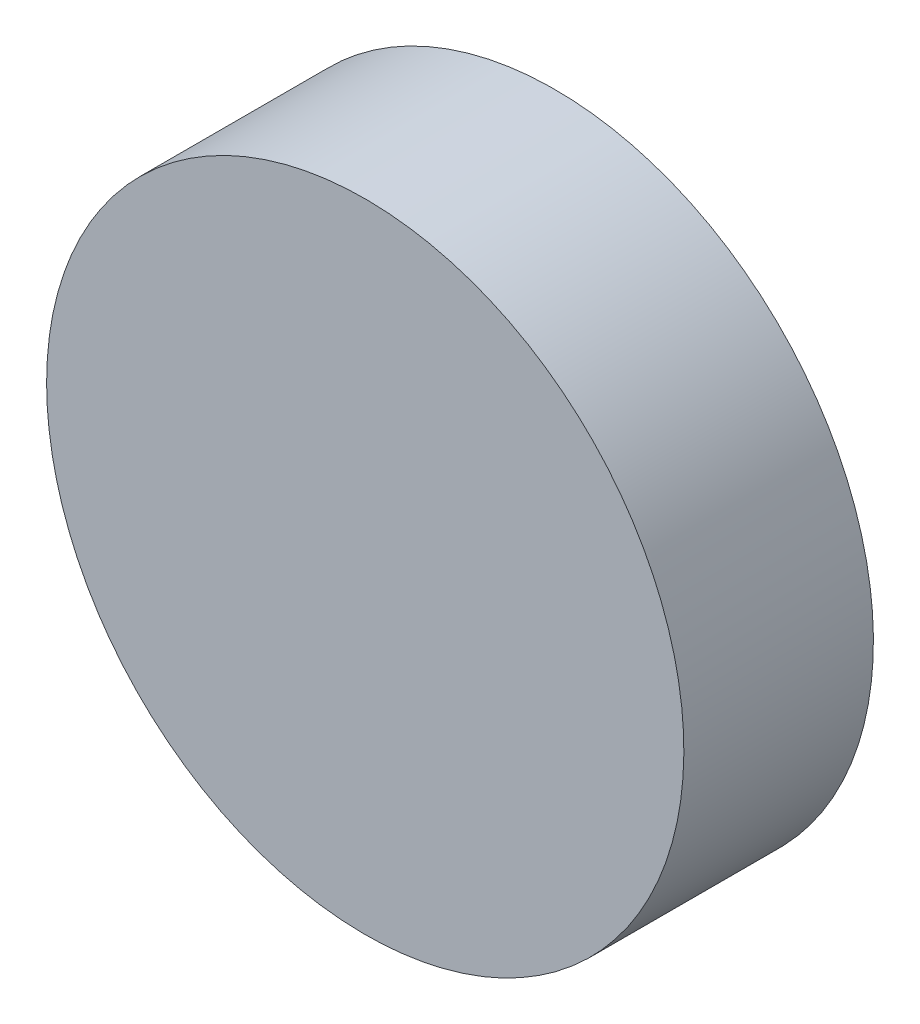
ISO-10303-21;
HEADER;
FILE_DESCRIPTION(('STEP AP214'),'2;1');
FILE_NAME('part.step','',(''),(''),'','','');
FILE_SCHEMA(('AUTOMOTIVE_DESIGN { 1 0 10303 214 1 1 1 1 }'));
ENDSEC;
DATA;
#1=APPLICATION_CONTEXT('core data for automotive mechanical design processes');
#2=APPLICATION_PROTOCOL_DEFINITION('international standard','automotive_design',2000,#1);
#3=PRODUCT_CONTEXT('',#1,'mechanical');
#4=PRODUCT('Part','Part','',(#3));
#5=PRODUCT_RELATED_PRODUCT_CATEGORY('part','',(#4));
#6=PRODUCT_DEFINITION_FORMATION('','',#4);
#7=PRODUCT_DEFINITION_CONTEXT('part definition',#1,'design');
#8=PRODUCT_DEFINITION('design','',#6,#7);
#9=PRODUCT_DEFINITION_SHAPE('','',#8);
#10=(LENGTH_UNIT() NAMED_UNIT(*) SI_UNIT(.MILLI.,.METRE.));
#11=(NAMED_UNIT(*) PLANE_ANGLE_UNIT() SI_UNIT($,.RADIAN.));
#12=(NAMED_UNIT(*) SI_UNIT($,.STERADIAN.) SOLID_ANGLE_UNIT());
#13=UNCERTAINTY_MEASURE_WITH_UNIT(LENGTH_MEASURE(1.E-05),#10,'distance_accuracy_value','');
#14=(GEOMETRIC_REPRESENTATION_CONTEXT(3) GLOBAL_UNCERTAINTY_ASSIGNED_CONTEXT((#13)) GLOBAL_UNIT_ASSIGNED_CONTEXT((#10,
#11,#12)) REPRESENTATION_CONTEXT('',''));
#15=CARTESIAN_POINT('',(0.,0.,0.));
#16=DIRECTION('',(0.,0.,1.));
#17=DIRECTION('',(1.,0.,0.));
#18=AXIS2_PLACEMENT_3D('',#15,#16,#17);
#19=CARTESIAN_POINT('',(993.755325930318,24.6841291296518,1149.40708096323));
#20=CARTESIAN_POINT('',(993.755325930318,23.7541445087736,1149.40708096323));
#21=CARTESIAN_POINT('',(993.93851691114,21.8941752670172,1149.40708096323));
#22=CARTESIAN_POINT('',(994.752316434851,19.2114377666996,1149.40708096323));
#23=CARTESIAN_POINT('',(996.073855151726,16.7390127263394,1149.40708096323));
#24=CARTESIAN_POINT('',(997.852347070006,14.571914053686,1149.40708096323));
#25=CARTESIAN_POINT('',(1000.01944574266,12.7934221354063,1149.40708096323));
#26=CARTESIAN_POINT('',(1002.49187078302,11.4718834185304,1149.40708096323));
#27=CARTESIAN_POINT('',(1005.17460828334,10.6580838948199,1149.40708096323));
#28=CARTESIAN_POINT('',(1007.96456214597,10.3832974235873,1149.40708096323));
#29=CARTESIAN_POINT('',(1010.75451600861,10.6580838948199,1149.40708096323));
#30=CARTESIAN_POINT('',(1013.43725350892,11.4718834185304,1149.40708096323));
#31=CARTESIAN_POINT('',(1015.90967854928,12.7934221354063,1149.40708096323));
#32=CARTESIAN_POINT('',(1018.07677722194,14.5719140536861,1149.40708096323));
#33=CARTESIAN_POINT('',(1019.85526914022,16.7390127263394,1149.40708096323));
#34=CARTESIAN_POINT('',(1021.17680785709,19.2114377666996,1149.40708096323));
#35=CARTESIAN_POINT('',(1021.9906073808,21.8941752670172,1149.40708096323));
#36=CARTESIAN_POINT('',(1022.26539385204,24.6841291296518,1149.40708096323));
#37=CARTESIAN_POINT('',(1021.9906073808,27.4740829922864,1149.40708096323));
#38=CARTESIAN_POINT('',(1021.17680785709,30.1568204926041,1149.40708096323));
#39=CARTESIAN_POINT('',(1019.85526914022,32.6292455329643,1149.40708096323));
#40=CARTESIAN_POINT('',(1018.07677722194,34.7963442056175,1149.40708096323));
#41=CARTESIAN_POINT('',(1015.90967854928,36.5748361238974,1149.40708096323));
#42=CARTESIAN_POINT('',(1013.43725350892,37.8963748407733,1149.40708096323));
#43=CARTESIAN_POINT('',(1010.75451600861,38.7101743644838,1149.40708096323));
#44=CARTESIAN_POINT('',(1007.96456214597,38.9849608357164,1149.40708096323));
#45=CARTESIAN_POINT('',(1005.17460828334,38.7101743644838,1149.40708096323));
#46=CARTESIAN_POINT('',(1002.49187078302,37.8963748407733,1149.40708096323));
#47=CARTESIAN_POINT('',(1000.01944574266,36.5748361238973,1149.40708096323));
#48=CARTESIAN_POINT('',(997.852347070006,34.7963442056177,1149.40708096323));
#49=CARTESIAN_POINT('',(996.073855151726,32.6292455329642,1149.40708096323));
#50=CARTESIAN_POINT('',(994.752316434851,30.1568204926041,1149.40708096323));
#51=CARTESIAN_POINT('',(993.93851691114,27.4740829922865,1149.40708096323));
#52=CARTESIAN_POINT('',(993.755325930318,25.61411375053,1149.40708096323));
#53=CARTESIAN_POINT('',(993.755325930318,24.6841291296518,1149.40708096323));
#54=B_SPLINE_CURVE_WITH_KNOTS('',3,(#19,#20,#21,#22,#23,#24,#25,#26,#27,#28,#29,#30,#31,#32,#33,
#34,#35,#36,#37,#38,#39,#40,#41,#42,#43,#44,#45,#46,#47,#48,#49,#50,#51,#52,#53),.UNSPECIFIED.,
.T.,.F.,(4,1,1,1,1,1,1,1,1,1,1,1,1,1,1,1,1,1,1,1,1,1,1,1,1,1,1,1,1,1,1,1,4),(0.,0.03125,
0.0625000000000003,0.0937500000000002,0.125,0.156249999999999,0.1875,0.218749999999999,0.25,
0.281250000000001,0.3125,0.343750000000001,0.375,0.40625,0.4375,0.46875,0.5,0.53125,0.5625,
0.59375,0.625,0.656249999999999,0.687499999999999,0.718749999999999,0.75,0.781250000000001,
0.8125,0.843750000000001,0.875,0.90625,0.9375,0.96875,1.),.UNSPECIFIED.);
#55=DIRECTION('',(0.,0.,1.));
#56=VECTOR('',#55,1.);
#57=SURFACE_OF_LINEAR_EXTRUSION('',#54,#56);
#58=CARTESIAN_POINT('',(993.755325930318,24.6841291296518,1149.40708096323));
#59=CARTESIAN_POINT('',(993.755325930318,23.7541445087736,1149.40708096323));
#60=CARTESIAN_POINT('',(993.93851691114,21.8941752670172,1149.40708096323));
#61=CARTESIAN_POINT('',(994.752316434851,19.2114377666996,1149.40708096323));
#62=CARTESIAN_POINT('',(996.073855151726,16.7390127263394,1149.40708096323));
#63=CARTESIAN_POINT('',(997.852347070006,14.571914053686,1149.40708096323));
#64=CARTESIAN_POINT('',(1000.01944574266,12.7934221354063,1149.40708096323));
#65=CARTESIAN_POINT('',(1002.49187078302,11.4718834185304,1149.40708096323));
#66=CARTESIAN_POINT('',(1005.17460828334,10.6580838948199,1149.40708096323));
#67=CARTESIAN_POINT('',(1007.96456214597,10.3832974235873,1149.40708096323));
#68=CARTESIAN_POINT('',(1010.75451600861,10.6580838948199,1149.40708096323));
#69=CARTESIAN_POINT('',(1013.43725350892,11.4718834185304,1149.40708096323));
#70=CARTESIAN_POINT('',(1015.90967854928,12.7934221354063,1149.40708096323));
#71=CARTESIAN_POINT('',(1018.07677722194,14.5719140536861,1149.40708096323));
#72=CARTESIAN_POINT('',(1019.85526914022,16.7390127263394,1149.40708096323));
#73=CARTESIAN_POINT('',(1021.17680785709,19.2114377666996,1149.40708096323));
#74=CARTESIAN_POINT('',(1021.9906073808,21.8941752670172,1149.40708096323));
#75=CARTESIAN_POINT('',(1022.26539385204,24.6841291296518,1149.40708096323));
#76=CARTESIAN_POINT('',(1021.9906073808,27.4740829922864,1149.40708096323));
#77=CARTESIAN_POINT('',(1021.17680785709,30.1568204926041,1149.40708096323));
#78=CARTESIAN_POINT('',(1019.85526914022,32.6292455329643,1149.40708096323));
#79=CARTESIAN_POINT('',(1018.07677722194,34.7963442056175,1149.40708096323));
#80=CARTESIAN_POINT('',(1015.90967854928,36.5748361238974,1149.40708096323));
#81=CARTESIAN_POINT('',(1013.43725350892,37.8963748407733,1149.40708096323));
#82=CARTESIAN_POINT('',(1010.75451600861,38.7101743644838,1149.40708096323));
#83=CARTESIAN_POINT('',(1007.96456214597,38.9849608357164,1149.40708096323));
#84=CARTESIAN_POINT('',(1005.17460828334,38.7101743644838,1149.40708096323));
#85=CARTESIAN_POINT('',(1002.49187078302,37.8963748407733,1149.40708096323));
#86=CARTESIAN_POINT('',(1000.01944574266,36.5748361238973,1149.40708096323));
#87=CARTESIAN_POINT('',(997.852347070006,34.7963442056177,1149.40708096323));
#88=CARTESIAN_POINT('',(996.073855151726,32.6292455329642,1149.40708096323));
#89=CARTESIAN_POINT('',(994.752316434851,30.1568204926041,1149.40708096323));
#90=CARTESIAN_POINT('',(993.93851691114,27.4740829922865,1149.40708096323));
#91=CARTESIAN_POINT('',(993.755325930318,25.61411375053,1149.40708096323));
#92=CARTESIAN_POINT('',(993.755325930318,24.6841291296518,1149.40708096323));
#93=B_SPLINE_CURVE_WITH_KNOTS('',3,(#58,#59,#60,#61,#62,#63,#64,#65,#66,#67,#68,#69,#70,#71,#72,
#73,#74,#75,#76,#77,#78,#79,#80,#81,#82,#83,#84,#85,#86,#87,#88,#89,#90,#91,#92),.UNSPECIFIED.,
.T.,.F.,(4,1,1,1,1,1,1,1,1,1,1,1,1,1,1,1,1,1,1,1,1,1,1,1,1,1,1,1,1,1,1,1,4),(0.,0.03125,
0.0625000000000003,0.0937500000000002,0.125,0.156249999999999,0.1875,0.218749999999999,0.25,
0.281250000000001,0.3125,0.343750000000001,0.375,0.40625,0.4375,0.46875,0.5,0.53125,0.5625,
0.59375,0.625,0.656249999999999,0.687499999999999,0.718749999999999,0.75,0.781250000000001,
0.8125,0.843750000000001,0.875,0.90625,0.9375,0.96875,1.),.UNSPECIFIED.);
#94=CARTESIAN_POINT('',(993.755325930318,24.6841291296518,1149.40708096323));
#95=VERTEX_POINT('',#94);
#96=EDGE_CURVE('E9',#95,#95,#93,.T.);
#97=ORIENTED_EDGE('',*,*,#96,.T.);
#98=EDGE_LOOP('',(#97));
#99=FACE_BOUND('',#98,.T.);
#100=CARTESIAN_POINT('',(993.755325930318,24.6841291296518,1157.86044483509));
#101=CARTESIAN_POINT('',(993.755325978543,24.9166267124819,1157.86044483509));
#102=CARTESIAN_POINT('',(993.761050716836,25.1491226032241,1157.86044483509));
#103=CARTESIAN_POINT('',(993.783894542001,25.6135559726693,1157.86044483509));
#104=CARTESIAN_POINT('',(993.801013717383,25.8454934470205,1157.86044483509));
#105=CARTESIAN_POINT('',(993.846591383454,26.3082513264879,1157.86044483509));
#106=CARTESIAN_POINT('',(993.875049874144,26.5390717316041,1157.86044483509));
#107=CARTESIAN_POINT('',(993.943251517209,26.9990382342235,1157.86044483509));
#108=CARTESIAN_POINT('',(993.982994581925,27.2281843447186,1157.86044483509));
#109=CARTESIAN_POINT('',(994.073710257848,27.6842428524153,1157.86044483509));
#110=CARTESIAN_POINT('',(994.124682869056,27.911155249617,1157.86044483509));
#111=CARTESIAN_POINT('',(994.237694339477,28.3622085586272,1157.86044483509));
#112=CARTESIAN_POINT('',(994.299733284648,28.5863494488934,1157.86044483509));
#113=CARTESIAN_POINT('',(994.434714738244,29.0313236684024,1157.86044483509));
#114=CARTESIAN_POINT('',(994.507657246667,29.2521569976453,1157.86044483509));
#115=CARTESIAN_POINT('',(994.664283436541,29.6899799286957,1157.86044483509));
#116=CARTESIAN_POINT('',(994.74796703455,29.9069695603472,1157.86044483509));
#117=CARTESIAN_POINT('',(994.925912232873,30.3365672715418,1157.86044483509));
#118=CARTESIAN_POINT('',(995.020173833185,30.5491753510848,1157.86044483509));
#119=CARTESIAN_POINT('',(995.219009955849,30.9695143556902,1157.86044483509));
#120=CARTESIAN_POINT('',(995.323584558303,31.1772452428544,1157.86044483509));
#121=CARTESIAN_POINT('',(995.542782544714,31.5873358315612,1157.86044483509));
#122=CARTESIAN_POINT('',(995.65740592867,31.7896955331038,1157.86044483509));
#123=CARTESIAN_POINT('',(995.896437606875,32.1885495656696,1157.86044483509));
#124=CARTESIAN_POINT('',(996.02084582511,32.3850439422418,1157.86044483509));
#125=CARTESIAN_POINT('',(996.279182212144,32.7716716677844,1157.86044483509));
#126=CARTESIAN_POINT('',(996.413110380944,32.9618050167546,1157.86044483509));
#127=CARTESIAN_POINT('',(996.690129995033,33.3352763220655,1157.86044483509));
#128=CARTESIAN_POINT('',(996.833221511493,33.5186142256087,1157.86044483509));
#129=CARTESIAN_POINT('',(997.128212375064,33.8780616328865,1157.86044483509));
#130=CARTESIAN_POINT('',(997.280111722175,34.054171136621,1157.86044483509));
#131=CARTESIAN_POINT('',(997.59236303536,34.3987285337189,1157.86044483509));
#132=CARTESIAN_POINT('',(997.752714935765,34.5671764865858,1157.86044483509));
#133=CARTESIAN_POINT('',(998.081514789038,34.8959763398583,1157.86044483509));
#134=CARTESIAN_POINT('',(998.249962741905,35.056328240264,1157.86044483509));
#135=CARTESIAN_POINT('',(998.594520139003,35.3685795534486,1157.86044483509));
#136=CARTESIAN_POINT('',(998.770629642737,35.5204789005598,1157.86044483509));
#137=CARTESIAN_POINT('',(999.130077050015,35.8154697641311,1157.86044483509));
#138=CARTESIAN_POINT('',(999.313414953558,35.9585612805911,1157.86044483509));
#139=CARTESIAN_POINT('',(999.686886258869,36.2355808946796,1157.86044483509));
#140=CARTESIAN_POINT('',(999.877019607839,36.3695090634794,1157.86044483509));
#141=CARTESIAN_POINT('',(1000.26364733338,36.627845450514,1157.86044483509));
#142=CARTESIAN_POINT('',(1000.46014170995,36.7522536687489,1157.86044483509));
#143=CARTESIAN_POINT('',(1000.85899574252,36.9912853469541,1157.86044483509));
#144=CARTESIAN_POINT('',(1001.06135544406,37.10590873091,1157.86044483509));
#145=CARTESIAN_POINT('',(1001.47144603277,37.3251067173203,1157.86044483509));
#146=CARTESIAN_POINT('',(1001.67917691993,37.4296813197748,1157.86044483509));
#147=CARTESIAN_POINT('',(1002.09951592455,37.6285174424389,1157.86044483509));
#148=CARTESIAN_POINT('',(1002.31212400411,37.7227790427526,1157.86044483509));
#149=CARTESIAN_POINT('',(1002.74172171525,37.9007242410723,1157.86044483509));
#150=CARTESIAN_POINT('',(1002.95871134683,37.9844078390784,1157.86044483509));
#151=CARTESIAN_POINT('',(1003.39653427808,38.1410340289612,1157.86044483509));
#152=CARTESIAN_POINT('',(1003.61736760758,38.2139765373979,1157.86044483509));
#153=CARTESIAN_POINT('',(1004.06234182637,38.3489579909574,1157.86044483509));
#154=CARTESIAN_POINT('',(1004.28648271565,38.4109969360802,1157.86044483509));
#155=CARTESIAN_POINT('',(1004.73753602736,38.5240084066345,1157.86044483509));
#156=CARTESIAN_POINT('',(1004.96444842824,38.5749810180244,1157.86044483509));
#157=CARTESIAN_POINT('',(1005.42050692587,38.6656966934506,1157.86044483509));
#158=CARTESIAN_POINT('',(1005.64965302261,38.705439757487,1157.86044483509));
#159=CARTESIAN_POINT('',(1006.10961956281,38.7736414024072,1157.86044483509));
#160=CARTESIAN_POINT('',(1006.34044001928,38.8020998956321,1157.86044483509));
#161=CARTESIAN_POINT('',(1006.80319775846,38.8476775547788,1157.86044483509));
#162=CARTESIAN_POINT('',(1007.03513504118,38.8647967207007,1157.86044483509));
#163=CARTESIAN_POINT('',(1007.49956893417,38.8876405717094,1157.86044483509));
#164=CARTESIAN_POINT('',(1007.73206554007,38.8933653453055,1157.86044483509));
#165=CARTESIAN_POINT('',(1008.19705875187,38.8933653453055,1157.86044483509));
#166=CARTESIAN_POINT('',(1008.42955535778,38.8876405717094,1157.86044483509));
#167=CARTESIAN_POINT('',(1008.89398925076,38.8647967207007,1157.86044483509));
#168=CARTESIAN_POINT('',(1009.12592653348,38.8476775547788,1157.86044483509));
#169=CARTESIAN_POINT('',(1009.58868427267,38.8020998956321,1157.86044483509));
#170=CARTESIAN_POINT('',(1009.81950472913,38.7736414024072,1157.86044483509));
#171=CARTESIAN_POINT('',(1010.27947126934,38.705439757487,1157.86044483509));
#172=CARTESIAN_POINT('',(1010.50861736607,38.6656966934506,1157.86044483509));
#173=CARTESIAN_POINT('',(1010.9646758637,38.5749810180244,1157.86044483509));
#174=CARTESIAN_POINT('',(1011.19158826459,38.5240084066345,1157.86044483509));
#175=CARTESIAN_POINT('',(1011.6426415763,38.4109969360802,1157.86044483509));
#176=CARTESIAN_POINT('',(1011.86678246557,38.3489579909574,1157.86044483509));
#177=CARTESIAN_POINT('',(1012.31175668436,38.2139765373979,1157.86044483509));
#178=CARTESIAN_POINT('',(1012.53259001387,38.1410340289613,1157.86044483509));
#179=CARTESIAN_POINT('',(1012.97041294511,37.9844078390784,1157.86044483509));
#180=CARTESIAN_POINT('',(1013.18740257669,37.9007242410723,1157.86044483509));
#181=CARTESIAN_POINT('',(1013.61700028784,37.7227790427525,1157.86044483509));
#182=CARTESIAN_POINT('',(1013.8296083674,37.6285174424389,1157.86044483509));
#183=CARTESIAN_POINT('',(1014.24994737202,37.4296813197748,1157.86044483509));
#184=CARTESIAN_POINT('',(1014.45767825918,37.3251067173204,1157.86044483509));
#185=CARTESIAN_POINT('',(1014.86776884788,37.10590873091,1157.86044483509));
#186=CARTESIAN_POINT('',(1015.07012854942,36.9912853469541,1157.86044483509));
#187=CARTESIAN_POINT('',(1015.46898258199,36.7522536687489,1157.86044483509));
#188=CARTESIAN_POINT('',(1015.66547695856,36.6278454505141,1157.86044483509));
#189=CARTESIAN_POINT('',(1016.0521046841,36.3695090634794,1157.86044483509));
#190=CARTESIAN_POINT('',(1016.24223803307,36.2355808946796,1157.86044483509));
#191=CARTESIAN_POINT('',(1016.61570933839,35.958561280591,1157.86044483509));
#192=CARTESIAN_POINT('',(1016.79904724193,35.8154697641311,1157.86044483509));
#193=CARTESIAN_POINT('',(1017.15849464921,35.5204789005598,1157.86044483509));
#194=CARTESIAN_POINT('',(1017.33460415294,35.3685795534486,1157.86044483509));
#195=CARTESIAN_POINT('',(1017.67916155004,35.056328240264,1157.86044483509));
#196=CARTESIAN_POINT('',(1017.84760950291,34.8959763398583,1157.86044483509));
#197=CARTESIAN_POINT('',(1018.17640935618,34.5671764865857,1157.86044483509));
#198=CARTESIAN_POINT('',(1018.33676125658,34.3987285337189,1157.86044483509));
#199=CARTESIAN_POINT('',(1018.64901256977,34.054171136621,1157.86044483509));
#200=CARTESIAN_POINT('',(1018.80091191688,33.8780616328864,1157.86044483509));
#201=CARTESIAN_POINT('',(1019.09590278045,33.5186142256087,1157.86044483509));
#202=CARTESIAN_POINT('',(1019.23899429691,33.3352763220655,1157.86044483509));
#203=CARTESIAN_POINT('',(1019.516013911,32.9618050167546,1157.86044483509));
#204=CARTESIAN_POINT('',(1019.6499420798,32.7716716677843,1157.86044483509));
#205=CARTESIAN_POINT('',(1019.90827846683,32.385043942242,1157.86044483509));
#206=CARTESIAN_POINT('',(1020.03268668507,32.1885495656701,1157.86044483509));
#207=CARTESIAN_POINT('',(1020.27171836327,31.7896955331033,1157.86044483509));
#208=CARTESIAN_POINT('',(1020.38634174723,31.5873358315594,1157.86044483509));
#209=CARTESIAN_POINT('',(1020.60553973364,31.1772452428563,1157.86044483509));
#210=CARTESIAN_POINT('',(1020.71011433609,30.9695143556972,1157.86044483509));
#211=CARTESIAN_POINT('',(1020.90895045876,30.5491753510779,1157.86044483509));
#212=CARTESIAN_POINT('',(1021.00321205907,30.3365672715158,1157.86044483509));
#213=CARTESIAN_POINT('',(1021.18115725739,29.9069695603732,1157.86044483509));
#214=CARTESIAN_POINT('',(1021.2648408554,29.6899799287926,1157.86044483509));
#215=CARTESIAN_POINT('',(1021.42146704528,29.2521569975484,1157.86044483509));
#216=CARTESIAN_POINT('',(1021.49440955372,29.0313236680408,1157.86044483509));
#217=CARTESIAN_POINT('',(1021.62939100728,28.5863494492549,1157.86044483509));
#218=CARTESIAN_POINT('',(1021.6914299524,28.3622085599766,1157.86044483509));
#219=CARTESIAN_POINT('',(1021.80444142295,27.9111552482677,1157.86044483509));
#220=CARTESIAN_POINT('',(1021.85541403434,27.6842428473795,1157.86044483509));
#221=CARTESIAN_POINT('',(1021.94612970977,27.2281843497544,1157.86044483509));
#222=CARTESIAN_POINT('',(1021.98587277381,26.9990382530175,1157.86044483509));
#223=CARTESIAN_POINT('',(1022.05407441873,26.5390717128099,1157.86044483509));
#224=CARTESIAN_POINT('',(1022.08253291195,26.3082512563468,1157.86044483509));
#225=CARTESIAN_POINT('',(1022.1281105711,25.8454935171615,1157.86044483509));
#226=CARTESIAN_POINT('',(1022.14522973702,25.6135562344393,1157.86044483509));
#227=CARTESIAN_POINT('',(1022.16807358803,25.1491223414561,1157.86044483509));
#228=CARTESIAN_POINT('',(1022.17379836163,24.916625735554,1157.86044483509));
#229=CARTESIAN_POINT('',(1022.17379836163,24.4516325237497,1157.86044483509));
#230=CARTESIAN_POINT('',(1022.16807358803,24.2191359178475,1157.86044483509));
#231=CARTESIAN_POINT('',(1022.14522973702,23.7547020248644,1157.86044483509));
#232=CARTESIAN_POINT('',(1022.1281105711,23.5227647421421,1157.86044483509));
#233=CARTESIAN_POINT('',(1022.08253291195,23.0600070029568,1157.86044483509));
#234=CARTESIAN_POINT('',(1022.05407441873,22.8291865464938,1157.86044483509));
#235=CARTESIAN_POINT('',(1021.98587277381,22.3692200062861,1157.86044483509));
#236=CARTESIAN_POINT('',(1021.94612970977,22.1400739095493,1157.86044483509));
#237=CARTESIAN_POINT('',(1021.85541403434,21.6840154119242,1157.86044483509));
#238=CARTESIAN_POINT('',(1021.80444142295,21.4571030110359,1157.86044483509));
#239=CARTESIAN_POINT('',(1021.6914299524,21.0060496993271,1157.86044483509));
#240=CARTESIAN_POINT('',(1021.62939100728,20.7819088100488,1157.86044483509));
#241=CARTESIAN_POINT('',(1021.49440955372,20.3369345912628,1157.86044483509));
#242=CARTESIAN_POINT('',(1021.42146704528,20.1161012617552,1157.86044483509));
#243=CARTESIAN_POINT('',(1021.2648408554,19.6782783305111,1157.86044483509));
#244=CARTESIAN_POINT('',(1021.18115725739,19.4612886989305,1157.86044483509));
#245=CARTESIAN_POINT('',(1021.00321205907,19.0316909877878,1157.86044483509));
#246=CARTESIAN_POINT('',(1020.90895045876,18.8190829082257,1157.86044483509));
#247=CARTESIAN_POINT('',(1020.71011433609,18.3987439036065,1157.86044483509));
#248=CARTESIAN_POINT('',(1020.60553973364,18.1910130164474,1157.86044483509));
#249=CARTESIAN_POINT('',(1020.38634174723,17.7809224277443,1157.86044483509));
#250=CARTESIAN_POINT('',(1020.27171836327,17.5785627262004,1157.86044483509));
#251=CARTESIAN_POINT('',(1020.03268668507,17.1797086936335,1157.86044483509));
#252=CARTESIAN_POINT('',(1019.90827846683,16.9832143170616,1157.86044483509));
#253=CARTESIAN_POINT('',(1019.6499420798,16.5965865915194,1157.86044483509));
#254=CARTESIAN_POINT('',(1019.516013911,16.4064532425491,1157.86044483509));
#255=CARTESIAN_POINT('',(1019.23899429691,16.0329819372382,1157.86044483509));
#256=CARTESIAN_POINT('',(1019.09590278045,15.8496440336949,1157.86044483509));
#257=CARTESIAN_POINT('',(1018.80091191688,15.4901966264172,1157.86044483509));
#258=CARTESIAN_POINT('',(1018.64901256977,15.3140871226827,1157.86044483509));
#259=CARTESIAN_POINT('',(1018.33676125658,14.9695297255848,1157.86044483509));
#260=CARTESIAN_POINT('',(1018.17640935618,14.8010817727179,1157.86044483509));
#261=CARTESIAN_POINT('',(1017.84760950291,14.4722819194453,1157.86044483509));
#262=CARTESIAN_POINT('',(1017.67916155004,14.3119300190397,1157.86044483509));
#263=CARTESIAN_POINT('',(1017.33460415294,13.9996787058551,1157.86044483509));
#264=CARTESIAN_POINT('',(1017.15849464921,13.8477793587438,1157.86044483509));
#265=CARTESIAN_POINT('',(1016.79904724193,13.5527884951726,1157.86044483509));
#266=CARTESIAN_POINT('',(1016.61570933839,13.4096969787126,1157.86044483509));
#267=CARTESIAN_POINT('',(1016.24223803307,13.1326773646241,1157.86044483509));
#268=CARTESIAN_POINT('',(1016.0521046841,12.9987491958242,1157.86044483509));
#269=CARTESIAN_POINT('',(1015.66547695856,12.7404128087896,1157.86044483509));
#270=CARTESIAN_POINT('',(1015.46898258199,12.6160045905548,1157.86044483509));
#271=CARTESIAN_POINT('',(1015.07012854942,12.3769729123496,1157.86044483509));
#272=CARTESIAN_POINT('',(1014.86776884788,12.2623495283937,1157.86044483509));
#273=CARTESIAN_POINT('',(1014.45767825918,12.0431515419833,1157.86044483509));
#274=CARTESIAN_POINT('',(1014.24994737202,11.9385769395288,1157.86044483509));
#275=CARTESIAN_POINT('',(1013.8296083674,11.7397408168647,1157.86044483509));
#276=CARTESIAN_POINT('',(1013.61700028784,11.6454792165511,1157.86044483509));
#277=CARTESIAN_POINT('',(1013.18740257669,11.4675340182314,1157.86044483509));
#278=CARTESIAN_POINT('',(1012.97041294511,11.3838504202252,1157.86044483509));
#279=CARTESIAN_POINT('',(1012.53259001387,11.2272242303424,1157.86044483509));
#280=CARTESIAN_POINT('',(1012.31175668436,11.1542817219058,1157.86044483509));
#281=CARTESIAN_POINT('',(1011.86678246557,11.0193002683463,1157.86044483509));
#282=CARTESIAN_POINT('',(1011.6426415763,10.9572613232235,1157.86044483509));
#283=CARTESIAN_POINT('',(1011.19158826459,10.8442498526691,1157.86044483509));
#284=CARTESIAN_POINT('',(1010.9646758637,10.7932772412793,1157.86044483509));
#285=CARTESIAN_POINT('',(1010.50861736607,10.7025615658531,1157.86044483509));
#286=CARTESIAN_POINT('',(1010.27947126934,10.6628185018167,1157.86044483509));
#287=CARTESIAN_POINT('',(1009.81950472913,10.5946168568965,1157.86044483509));
#288=CARTESIAN_POINT('',(1009.58868427267,10.5661583636716,1157.86044483509));
#289=CARTESIAN_POINT('',(1009.12592653348,10.5205807045248,1157.86044483509));
#290=CARTESIAN_POINT('',(1008.89398925076,10.503461538603,1157.86044483509));
#291=CARTESIAN_POINT('',(1008.42955535778,10.4806176875943,1157.86044483509));
#292=CARTESIAN_POINT('',(1008.19705875187,10.4748929139981,1157.86044483509));
#293=CARTESIAN_POINT('',(1007.73206554007,10.4748929139981,1157.86044483509));
#294=CARTESIAN_POINT('',(1007.49956893417,10.4806176875943,1157.86044483509));
#295=CARTESIAN_POINT('',(1007.03513504118,10.503461538603,1157.86044483509));
#296=CARTESIAN_POINT('',(1006.80319775846,10.5205807045249,1157.86044483509));
#297=CARTESIAN_POINT('',(1006.34044001928,10.5661583636716,1157.86044483509));
#298=CARTESIAN_POINT('',(1006.10961956281,10.5946168568964,1157.86044483509));
#299=CARTESIAN_POINT('',(1005.64965302261,10.6628185018167,1157.86044483509));
#300=CARTESIAN_POINT('',(1005.42050692587,10.7025615658531,1157.86044483509));
#301=CARTESIAN_POINT('',(1004.96444842824,10.7932772412793,1157.86044483509));
#302=CARTESIAN_POINT('',(1004.73753602736,10.8442498526691,1157.86044483509));
#303=CARTESIAN_POINT('',(1004.28648271565,10.9572613232235,1157.86044483509));
#304=CARTESIAN_POINT('',(1004.06234182637,11.0193002683462,1157.86044483509));
#305=CARTESIAN_POINT('',(1003.61736760758,11.1542817219057,1157.86044483509));
#306=CARTESIAN_POINT('',(1003.39653427808,11.2272242303425,1157.86044483509));
#307=CARTESIAN_POINT('',(1002.95871134683,11.3838504202253,1157.86044483509));
#308=CARTESIAN_POINT('',(1002.74172171525,11.4675340182314,1157.86044483509));
#309=CARTESIAN_POINT('',(1002.31212400411,11.6454792165511,1157.86044483509));
#310=CARTESIAN_POINT('',(1002.09951592455,11.7397408168647,1157.86044483509));
#311=CARTESIAN_POINT('',(1001.67917691993,11.9385769395289,1157.86044483509));
#312=CARTESIAN_POINT('',(1001.47144603277,12.0431515419833,1157.86044483509));
#313=CARTESIAN_POINT('',(1001.06135544406,12.2623495283937,1157.86044483509));
#314=CARTESIAN_POINT('',(1000.85899574252,12.3769729123496,1157.86044483509));
#315=CARTESIAN_POINT('',(1000.46014170995,12.6160045905548,1157.86044483509));
#316=CARTESIAN_POINT('',(1000.26364733338,12.7404128087896,1157.86044483509));
#317=CARTESIAN_POINT('',(999.87701960784,12.9987491958243,1157.86044483509));
#318=CARTESIAN_POINT('',(999.686886258869,13.1326773646241,1157.86044483509));
#319=CARTESIAN_POINT('',(999.313414953558,13.4096969787127,1157.86044483509));
#320=CARTESIAN_POINT('',(999.130077050015,13.5527884951726,1157.86044483509));
#321=CARTESIAN_POINT('',(998.770629642737,13.8477793587438,1157.86044483509));
#322=CARTESIAN_POINT('',(998.594520139003,13.9996787058551,1157.86044483509));
#323=CARTESIAN_POINT('',(998.249962741905,14.3119300190397,1157.86044483509));
#324=CARTESIAN_POINT('',(998.081514789038,14.4722819194454,1157.86044483509));
#325=CARTESIAN_POINT('',(997.752714935765,14.8010817727179,1157.86044483509));
#326=CARTESIAN_POINT('',(997.592363035359,14.9695297255847,1157.86044483509));
#327=CARTESIAN_POINT('',(997.280111722175,15.3140871226826,1157.86044483509));
#328=CARTESIAN_POINT('',(997.128212375064,15.4901966264172,1157.86044483509));
#329=CARTESIAN_POINT('',(996.833221511492,15.849644033695,1157.86044483509));
#330=CARTESIAN_POINT('',(996.690129995033,16.0329819372382,1157.86044483509));
#331=CARTESIAN_POINT('',(996.413110380944,16.406453242549,1157.86044483509));
#332=CARTESIAN_POINT('',(996.279182212144,16.5965865915193,1157.86044483509));
#333=CARTESIAN_POINT('',(996.02084582511,16.9832143170618,1157.86044483509));
#334=CARTESIAN_POINT('',(995.896437606875,17.1797086936341,1157.86044483509));
#335=CARTESIAN_POINT('',(995.65740592867,17.5785627261999,1157.86044483509));
#336=CARTESIAN_POINT('',(995.542782544714,17.7809224277424,1157.86044483509));
#337=CARTESIAN_POINT('',(995.323584558303,18.1910130164492,1157.86044483509));
#338=CARTESIAN_POINT('',(995.219009955849,18.3987439036135,1157.86044483509));
#339=CARTESIAN_POINT('',(995.020173833185,18.8190829082188,1157.86044483509));
#340=CARTESIAN_POINT('',(994.925912232872,19.0316909877619,1157.86044483509));
#341=CARTESIAN_POINT('',(994.74796703455,19.4612886989565,1157.86044483509));
#342=CARTESIAN_POINT('',(994.66428343654,19.678278330608,1157.86044483509));
#343=CARTESIAN_POINT('',(994.507657246667,20.1161012616584,1157.86044483509));
#344=CARTESIAN_POINT('',(994.434714738244,20.3369345909013,1157.86044483509));
#345=CARTESIAN_POINT('',(994.299733284648,20.7819088104103,1157.86044483509));
#346=CARTESIAN_POINT('',(994.237694339477,21.0060497006765,1157.86044483509));
#347=CARTESIAN_POINT('',(994.124682869056,21.4571030096866,1157.86044483509));
#348=CARTESIAN_POINT('',(994.073710257848,21.6840154068883,1157.86044483509));
#349=CARTESIAN_POINT('',(993.982994581925,22.1400739145851,1157.86044483509));
#350=CARTESIAN_POINT('',(993.943251517209,22.3692200250802,1157.86044483509));
#351=CARTESIAN_POINT('',(993.875049874144,22.8291865276996,1157.86044483509));
#352=CARTESIAN_POINT('',(993.846591383454,23.0600069328158,1157.86044483509));
#353=CARTESIAN_POINT('',(993.801013717382,23.5227648122832,1157.86044483509));
#354=CARTESIAN_POINT('',(993.783894542001,23.7547022866344,1157.86044483509));
#355=CARTESIAN_POINT('',(993.761050716836,24.2191356560795,1157.86044483509));
#356=CARTESIAN_POINT('',(993.755325978543,24.4516315468218,1157.86044483509));
#357=CARTESIAN_POINT('',(993.755325930318,24.6841291296518,1157.86044483509));
#358=B_SPLINE_CURVE_WITH_KNOTS('',3,(#100,#101,#102,#103,#104,#105,#106,#107,#108,#109,#110,
#111,#112,#113,#114,#115,#116,#117,#118,#119,#120,#121,#122,#123,#124,#125,#126,#127,#128,#129,
#130,#131,#132,#133,#134,#135,#136,#137,#138,#139,#140,#141,#142,#143,#144,#145,#146,#147,#148,
#149,#150,#151,#152,#153,#154,#155,#156,#157,#158,#159,#160,#161,#162,#163,#164,#165,#166,#167,
#168,#169,#170,#171,#172,#173,#174,#175,#176,#177,#178,#179,#180,#181,#182,#183,#184,#185,#186,
#187,#188,#189,#190,#191,#192,#193,#194,#195,#196,#197,#198,#199,#200,#201,#202,#203,#204,#205,
#206,#207,#208,#209,#210,#211,#212,#213,#214,#215,#216,#217,#218,#219,#220,#221,#222,#223,#224,
#225,#226,#227,#228,#229,#230,#231,#232,#233,#234,#235,#236,#237,#238,#239,#240,#241,#242,#243,
#244,#245,#246,#247,#248,#249,#250,#251,#252,#253,#254,#255,#256,#257,#258,#259,#260,#261,#262,
#263,#264,#265,#266,#267,#268,#269,#270,#271,#272,#273,#274,#275,#276,#277,#278,#279,#280,#281,
#282,#283,#284,#285,#286,#287,#288,#289,#290,#291,#292,#293,#294,#295,#296,#297,#298,#299,#300,
#301,#302,#303,#304,#305,#306,#307,#308,#309,#310,#311,#312,#313,#314,#315,#316,#317,#318,#319,
#320,#321,#322,#323,#324,#325,#326,#327,#328,#329,#330,#331,#332,#333,#334,#335,#336,#337,#338,
#339,#340,#341,#342,#343,#344,#345,#346,#347,#348,#349,#350,#351,#352,#353,#354,#355,#356,#357),
.UNSPECIFIED.,.F.,.F.,(4,2,2,2,2,2,2,2,2,2,2,2,2,2,2,2,2,2,2,2,2,2,2,2,2,2,2,2,2,2,2,2,2,2,2,2,
2,2,2,2,2,2,2,2,2,2,2,2,2,2,2,2,2,2,2,2,2,2,2,2,2,2,2,2,2,2,2,2,2,2,2,2,2,2,2,2,2,2,2,2,2,2,2,2,
2,2,2,2,2,2,2,2,2,2,2,2,2,2,2,2,2,2,2,2,2,2,2,2,2,2,2,2,2,2,2,2,2,2,2,2,2,2,2,2,2,2,2,2,4),(0.,
0.697420070655532,1.39484555879202,2.09227104692848,2.78969111758397,3.4871111882395,
4.18453667637596,4.88196216451246,5.57938223516795,6.27680230582355,6.97422779395991,
7.67165328209637,8.36907335275193,9.06649342340744,9.76391891154395,10.4613443996804,
11.158764470336,11.8561845409915,12.553610029128,13.2510355172642,13.9484555879199,
14.6458756585754,15.3433011467119,16.0407266348484,16.7381467055039,17.4355667761596,
18.1329922642959,18.8304177524327,19.527837823088,20.2252578937436,20.9226833818799,
21.6201088700164,22.3175289406719,23.0149490113274,23.7123744994641,24.4097999876005,
25.1072200582562,25.8046401289115,26.5020656170479,27.1994911051844,27.8969111758397,
28.5943312464952,29.2917567346319,29.9891822227682,30.6866022934237,31.3840223640792,
32.0814478522156,32.7788733403521,33.4762934110076,34.1737134816632,34.8711389697997,
35.5685644579363,36.2659845285918,36.9634045992474,37.6608300873839,38.3582555755203,
39.0556756461757,39.7530957168313,40.4505212049677,41.1479466931042,41.8453667637597,
42.5427868344153,43.2402123225517,43.9376378106882,44.6350578813437,45.3324779519993,
46.0299034401358,46.7273289282723,47.4247489989278,48.1221690695833,48.8195945577199,
49.5170200458562,50.2144401165116,50.9118601871671,51.6092856753038,52.3067111634402,
53.0041312340956,53.7015513047512,54.3989767928876,55.0964022810241,55.7938223516795,
56.491242422335,57.1886679104715,57.8860933986079,58.5835134692635,59.280933539919,
59.9783590280555,60.6757845161923,61.3732045868478,62.0706246575031,62.7680501456398,
63.465475633776,64.1628957044315,64.860315775087,65.5577412632233,66.2551667513601,
66.9525868220155,67.650006892671,68.3474323808075,69.0448578689441,69.7422779395994,
70.4396980102551,71.1371234983918,71.834548986528,72.5319690571838,73.2293891278391,
73.9268146159754,74.6242401041119,75.3216601747674,76.0190802454229,76.7165057335596,
77.413931221696,78.1113512923516,78.8087713630073,79.5061968511436,80.2036223392802,
80.9010424099356,81.5984624805911,82.2958879687276,82.993313456864,83.6907335275196,
84.3881535981751,85.0855790863115,85.783004574448,86.4804246451035,87.177844715759,
87.8752702038955,88.572695692032,89.2701157626875),.UNSPECIFIED.);
#359=CARTESIAN_POINT('',(993.755325930318,24.6841291296518,1157.86044483509));
#360=VERTEX_POINT('',#359);
#361=EDGE_CURVE('E24',#360,#360,#358,.F.);
#362=ORIENTED_EDGE('',*,*,#361,.F.);
#363=EDGE_LOOP('',(#362));
#364=FACE_BOUND('',#363,.T.);
#365=ADVANCED_FACE('F14',(#99,#364),#57,.T.);
#366=CARTESIAN_POINT('',(994.114562145972,24.6841291296518,1149.40708096323));
#367=DIRECTION('',(0.,0.,1.));
#368=DIRECTION('',(0.,-1.,0.));
#369=AXIS2_PLACEMENT_3D('',#366,#367,#368);
#370=PLANE('',#369);
#371=ORIENTED_EDGE('',*,*,#96,.F.);
#372=EDGE_LOOP('',(#371));
#373=FACE_BOUND('',#372,.T.);
#374=ADVANCED_FACE('F62',(#373),#370,.F.);
#375=CARTESIAN_POINT('',(994.114562145972,24.6841291296518,1157.86044483509));
#376=DIRECTION('',(0.,0.,1.));
#377=DIRECTION('',(0.,-1.,0.));
#378=AXIS2_PLACEMENT_3D('',#375,#376,#377);
#379=PLANE('',#378);
#380=ORIENTED_EDGE('',*,*,#361,.T.);
#381=EDGE_LOOP('',(#380));
#382=FACE_BOUND('',#381,.T.);
#383=ADVANCED_FACE('F31',(#382),#379,.T.);
#384=CLOSED_SHELL('',(#365,#374,#383));
#385=MANIFOLD_SOLID_BREP('B1',#384);
#386=ADVANCED_BREP_SHAPE_REPRESENTATION('',(#18,#385),#14);
#387=SHAPE_DEFINITION_REPRESENTATION(#9,#386);
ENDSEC;
END-ISO-10303-21;
